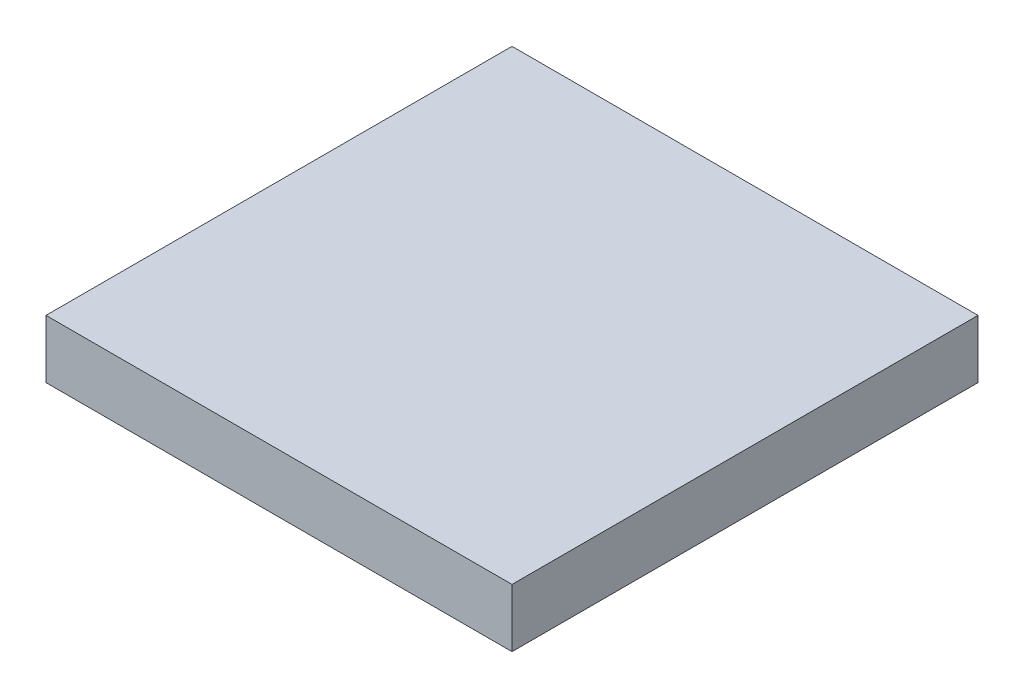
ISO-10303-21;
HEADER;
FILE_DESCRIPTION(('STEP AP214'),'2;1');
FILE_NAME('part.step','',(''),(''),'','','');
FILE_SCHEMA(('AUTOMOTIVE_DESIGN { 1 0 10303 214 1 1 1 1 }'));
ENDSEC;
DATA;
#1=APPLICATION_CONTEXT('core data for automotive mechanical design processes');
#2=APPLICATION_PROTOCOL_DEFINITION('international standard','automotive_design',2000,#1);
#3=PRODUCT_CONTEXT('',#1,'mechanical');
#4=PRODUCT('Part','Part','',(#3));
#5=PRODUCT_RELATED_PRODUCT_CATEGORY('part','',(#4));
#6=PRODUCT_DEFINITION_FORMATION('','',#4);
#7=PRODUCT_DEFINITION_CONTEXT('part definition',#1,'design');
#8=PRODUCT_DEFINITION('design','',#6,#7);
#9=PRODUCT_DEFINITION_SHAPE('','',#8);
#10=(LENGTH_UNIT() NAMED_UNIT(*) SI_UNIT(.MILLI.,.METRE.));
#11=(NAMED_UNIT(*) PLANE_ANGLE_UNIT() SI_UNIT($,.RADIAN.));
#12=(NAMED_UNIT(*) SI_UNIT($,.STERADIAN.) SOLID_ANGLE_UNIT());
#13=UNCERTAINTY_MEASURE_WITH_UNIT(LENGTH_MEASURE(1.E-05),#10,'distance_accuracy_value','');
#14=(GEOMETRIC_REPRESENTATION_CONTEXT(3) GLOBAL_UNCERTAINTY_ASSIGNED_CONTEXT((#13)) GLOBAL_UNIT_ASSIGNED_CONTEXT((#10,
#11,#12)) REPRESENTATION_CONTEXT('',''));
#15=CARTESIAN_POINT('',(0.,0.,0.));
#16=DIRECTION('',(0.,0.,1.));
#17=DIRECTION('',(1.,0.,0.));
#18=AXIS2_PLACEMENT_3D('',#15,#16,#17);
#19=CARTESIAN_POINT('',(150.,1800.,-500.));
#20=DIRECTION('',(-1.,0.,0.));
#21=DIRECTION('',(0.,0.,1.));
#22=AXIS2_PLACEMENT_3D('',#19,#20,#21);
#23=PLANE('',#22);
#24=DIRECTION('',(0.,-1.,0.));
#25=VECTOR('',#24,1.);
#26=CARTESIAN_POINT('',(150.,1800.,-100.));
#27=LINE('',#26,#25);
#28=CARTESIAN_POINT('',(150.,1850.,-100.));
#29=VERTEX_POINT('',#28);
#30=CARTESIAN_POINT('',(150.,1800.,-100.));
#31=VERTEX_POINT('',#30);
#32=EDGE_CURVE('E103',#29,#31,#27,.T.);
#33=ORIENTED_EDGE('',*,*,#32,.F.);
#34=DIRECTION('',(0.,0.,1.));
#35=VECTOR('',#34,1.);
#36=CARTESIAN_POINT('',(150.,1850.,-500.));
#37=LINE('',#36,#35);
#38=CARTESIAN_POINT('',(150.,1850.,-500.));
#39=VERTEX_POINT('',#38);
#40=EDGE_CURVE('E11',#39,#29,#37,.T.);
#41=ORIENTED_EDGE('',*,*,#40,.F.);
#42=DIRECTION('',(0.,-1.,0.));
#43=VECTOR('',#42,1.);
#44=CARTESIAN_POINT('',(150.,1800.,-500.));
#45=LINE('',#44,#43);
#46=CARTESIAN_POINT('',(150.,1800.,-500.));
#47=VERTEX_POINT('',#46);
#48=EDGE_CURVE('E97',#39,#47,#45,.T.);
#49=ORIENTED_EDGE('',*,*,#48,.T.);
#50=DIRECTION('',(0.,0.,1.));
#51=VECTOR('',#50,1.);
#52=CARTESIAN_POINT('',(150.,1800.,-500.));
#53=LINE('',#52,#51);
#54=EDGE_CURVE('E42',#47,#31,#53,.T.);
#55=ORIENTED_EDGE('',*,*,#54,.T.);
#56=EDGE_LOOP('',(#33,#41,#49,#55));
#57=FACE_BOUND('',#56,.T.);
#58=ADVANCED_FACE('F39',(#57),#23,.T.);
#59=CARTESIAN_POINT('',(150.,1850.,-500.));
#60=DIRECTION('',(0.,1.,0.));
#61=DIRECTION('',(0.,0.,1.));
#62=AXIS2_PLACEMENT_3D('',#59,#60,#61);
#63=PLANE('',#62);
#64=DIRECTION('',(-1.,0.,0.));
#65=VECTOR('',#64,1.);
#66=CARTESIAN_POINT('',(150.,1850.,-100.));
#67=LINE('',#66,#65);
#68=CARTESIAN_POINT('',(550.,1850.,-100.));
#69=VERTEX_POINT('',#68);
#70=EDGE_CURVE('E99',#69,#29,#67,.T.);
#71=ORIENTED_EDGE('',*,*,#70,.F.);
#72=DIRECTION('',(0.,0.,1.));
#73=VECTOR('',#72,1.);
#74=CARTESIAN_POINT('',(550.,1850.,-500.));
#75=LINE('',#74,#73);
#76=CARTESIAN_POINT('',(550.,1850.,-500.));
#77=VERTEX_POINT('',#76);
#78=EDGE_CURVE('E48',#77,#69,#75,.T.);
#79=ORIENTED_EDGE('',*,*,#78,.F.);
#80=DIRECTION('',(-1.,0.,0.));
#81=VECTOR('',#80,1.);
#82=CARTESIAN_POINT('',(150.,1850.,-500.));
#83=LINE('',#82,#81);
#84=EDGE_CURVE('E94',#77,#39,#83,.T.);
#85=ORIENTED_EDGE('',*,*,#84,.T.);
#86=ORIENTED_EDGE('',*,*,#40,.T.);
#87=EDGE_LOOP('',(#71,#79,#85,#86));
#88=FACE_BOUND('',#87,.T.);
#89=ADVANCED_FACE('F113',(#88),#63,.T.);
#90=CARTESIAN_POINT('',(550.,1800.,-500.));
#91=DIRECTION('',(1.,0.,0.));
#92=DIRECTION('',(0.,0.,-1.));
#93=AXIS2_PLACEMENT_3D('',#90,#91,#92);
#94=PLANE('',#93);
#95=DIRECTION('',(0.,1.,0.));
#96=VECTOR('',#95,1.);
#97=CARTESIAN_POINT('',(550.,1800.,-100.));
#98=LINE('',#97,#96);
#99=CARTESIAN_POINT('',(550.,1800.,-100.));
#100=VERTEX_POINT('',#99);
#101=EDGE_CURVE('E89',#100,#69,#98,.T.);
#102=ORIENTED_EDGE('',*,*,#101,.F.);
#103=DIRECTION('',(0.,0.,1.));
#104=VECTOR('',#103,1.);
#105=CARTESIAN_POINT('',(550.,1800.,-500.));
#106=LINE('',#105,#104);
#107=CARTESIAN_POINT('',(550.,1800.,-500.));
#108=VERTEX_POINT('',#107);
#109=EDGE_CURVE('E84',#108,#100,#106,.T.);
#110=ORIENTED_EDGE('',*,*,#109,.F.);
#111=DIRECTION('',(0.,1.,0.));
#112=VECTOR('',#111,1.);
#113=CARTESIAN_POINT('',(550.,1800.,-500.));
#114=LINE('',#113,#112);
#115=EDGE_CURVE('E87',#108,#77,#114,.T.);
#116=ORIENTED_EDGE('',*,*,#115,.T.);
#117=ORIENTED_EDGE('',*,*,#78,.T.);
#118=EDGE_LOOP('',(#102,#110,#116,#117));
#119=FACE_BOUND('',#118,.T.);
#120=ADVANCED_FACE('F86',(#119),#94,.T.);
#121=CARTESIAN_POINT('',(150.,1800.,-500.));
#122=DIRECTION('',(0.,-1.,0.));
#123=DIRECTION('',(0.,0.,-1.));
#124=AXIS2_PLACEMENT_3D('',#121,#122,#123);
#125=PLANE('',#124);
#126=DIRECTION('',(1.,0.,0.));
#127=VECTOR('',#126,1.);
#128=CARTESIAN_POINT('',(150.,1800.,-100.));
#129=LINE('',#128,#127);
#130=EDGE_CURVE('E106',#31,#100,#129,.T.);
#131=ORIENTED_EDGE('',*,*,#130,.F.);
#132=ORIENTED_EDGE('',*,*,#54,.F.);
#133=DIRECTION('',(1.,0.,0.));
#134=VECTOR('',#133,1.);
#135=CARTESIAN_POINT('',(150.,1800.,-500.));
#136=LINE('',#135,#134);
#137=EDGE_CURVE('E93',#47,#108,#136,.T.);
#138=ORIENTED_EDGE('',*,*,#137,.T.);
#139=ORIENTED_EDGE('',*,*,#109,.T.);
#140=EDGE_LOOP('',(#131,#132,#138,#139));
#141=FACE_BOUND('',#140,.T.);
#142=ADVANCED_FACE('F96',(#141),#125,.T.);
#143=CARTESIAN_POINT('',(0.,0.,-500.));
#144=DIRECTION('',(0.,0.,-1.));
#145=DIRECTION('',(-1.,0.,0.));
#146=AXIS2_PLACEMENT_3D('',#143,#144,#145);
#147=PLANE('',#146);
#148=ORIENTED_EDGE('',*,*,#48,.F.);
#149=ORIENTED_EDGE('',*,*,#84,.F.);
#150=ORIENTED_EDGE('',*,*,#115,.F.);
#151=ORIENTED_EDGE('',*,*,#137,.F.);
#152=EDGE_LOOP('',(#148,#149,#150,#151));
#153=FACE_BOUND('',#152,.T.);
#154=ADVANCED_FACE('F92',(#153),#147,.T.);
#155=CARTESIAN_POINT('',(0.,0.,-100.));
#156=DIRECTION('',(0.,0.,-1.));
#157=DIRECTION('',(-1.,0.,0.));
#158=AXIS2_PLACEMENT_3D('',#155,#156,#157);
#159=PLANE('',#158);
#160=ORIENTED_EDGE('',*,*,#32,.T.);
#161=ORIENTED_EDGE('',*,*,#130,.T.);
#162=ORIENTED_EDGE('',*,*,#101,.T.);
#163=ORIENTED_EDGE('',*,*,#70,.T.);
#164=EDGE_LOOP('',(#160,#161,#162,#163));
#165=FACE_BOUND('',#164,.T.);
#166=ADVANCED_FACE('F112',(#165),#159,.F.);
#167=CLOSED_SHELL('',(#58,#89,#120,#142,#154,#166));
#168=MANIFOLD_SOLID_BREP('B2',#167);
#169=ADVANCED_BREP_SHAPE_REPRESENTATION('',(#18,#168),#14);
#170=SHAPE_DEFINITION_REPRESENTATION(#9,#169);
ENDSEC;
END-ISO-10303-21;
